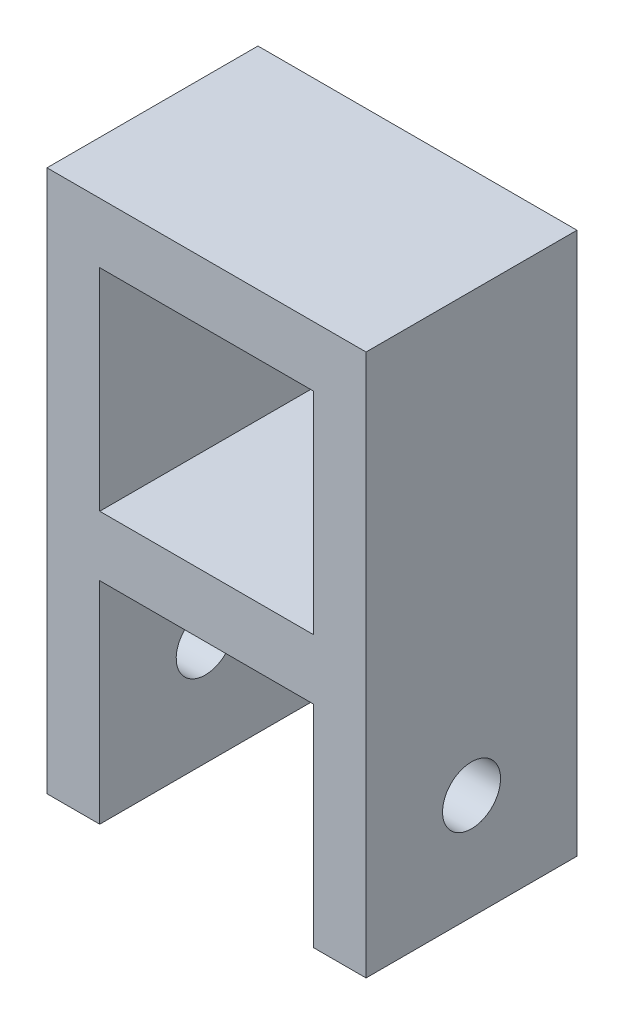
ISO-10303-21;
HEADER;
FILE_DESCRIPTION(('STEP AP214'),'2;1');
FILE_NAME('part.step','',(''),(''),'','','');
FILE_SCHEMA(('AUTOMOTIVE_DESIGN { 1 0 10303 214 1 1 1 1 }'));
ENDSEC;
DATA;
#1=APPLICATION_CONTEXT('core data for automotive mechanical design processes');
#2=APPLICATION_PROTOCOL_DEFINITION('international standard','automotive_design',2000,#1);
#3=PRODUCT_CONTEXT('',#1,'mechanical');
#4=PRODUCT('Part','Part','',(#3));
#5=PRODUCT_RELATED_PRODUCT_CATEGORY('part','',(#4));
#6=PRODUCT_DEFINITION_FORMATION('','',#4);
#7=PRODUCT_DEFINITION_CONTEXT('part definition',#1,'design');
#8=PRODUCT_DEFINITION('design','',#6,#7);
#9=PRODUCT_DEFINITION_SHAPE('','',#8);
#10=(LENGTH_UNIT() NAMED_UNIT(*) SI_UNIT(.MILLI.,.METRE.));
#11=(NAMED_UNIT(*) PLANE_ANGLE_UNIT() SI_UNIT($,.RADIAN.));
#12=(NAMED_UNIT(*) SI_UNIT($,.STERADIAN.) SOLID_ANGLE_UNIT());
#13=UNCERTAINTY_MEASURE_WITH_UNIT(LENGTH_MEASURE(1.E-05),#10,'distance_accuracy_value','');
#14=(GEOMETRIC_REPRESENTATION_CONTEXT(3) GLOBAL_UNCERTAINTY_ASSIGNED_CONTEXT((#13)) GLOBAL_UNIT_ASSIGNED_CONTEXT((#10,
#11,#12)) REPRESENTATION_CONTEXT('',''));
#15=CARTESIAN_POINT('',(0.,0.,0.));
#16=DIRECTION('',(0.,0.,1.));
#17=DIRECTION('',(1.,0.,0.));
#18=AXIS2_PLACEMENT_3D('',#15,#16,#17);
#19=CARTESIAN_POINT('',(0.,0.,20.));
#20=DIRECTION('',(0.,0.,-1.));
#21=DIRECTION('',(-1.,0.,0.));
#22=AXIS2_PLACEMENT_3D('',#19,#20,#21);
#23=PLANE('',#22);
#24=DIRECTION('',(1.,0.,0.));
#25=VECTOR('',#24,1.);
#26=CARTESIAN_POINT('',(-10.125,0.,20.));
#27=LINE('',#26,#25);
#28=CARTESIAN_POINT('',(-15.125,0.,20.));
#29=VERTEX_POINT('',#28);
#30=CARTESIAN_POINT('',(-10.125,0.,20.));
#31=VERTEX_POINT('',#30);
#32=EDGE_CURVE('E179',#29,#31,#27,.T.);
#33=ORIENTED_EDGE('',*,*,#32,.T.);
#34=DIRECTION('',(0.,1.,0.));
#35=VECTOR('',#34,1.);
#36=CARTESIAN_POINT('',(-10.125,0.,20.));
#37=LINE('',#36,#35);
#38=CARTESIAN_POINT('',(-10.125,20.,20.));
#39=VERTEX_POINT('',#38);
#40=EDGE_CURVE('E183',#31,#39,#37,.T.);
#41=ORIENTED_EDGE('',*,*,#40,.T.);
#42=DIRECTION('',(1.,0.,0.));
#43=VECTOR('',#42,1.);
#44=CARTESIAN_POINT('',(-10.125,20.,20.));
#45=LINE('',#44,#43);
#46=CARTESIAN_POINT('',(10.125,20.,20.));
#47=VERTEX_POINT('',#46);
#48=EDGE_CURVE('E187',#39,#47,#45,.T.);
#49=ORIENTED_EDGE('',*,*,#48,.T.);
#50=DIRECTION('',(0.,-1.,0.));
#51=VECTOR('',#50,1.);
#52=CARTESIAN_POINT('',(10.125,0.,20.));
#53=LINE('',#52,#51);
#54=CARTESIAN_POINT('',(10.125,0.,20.));
#55=VERTEX_POINT('',#54);
#56=EDGE_CURVE('E190',#47,#55,#53,.T.);
#57=ORIENTED_EDGE('',*,*,#56,.T.);
#58=DIRECTION('',(1.,0.,0.));
#59=VECTOR('',#58,1.);
#60=CARTESIAN_POINT('',(10.125,0.,20.));
#61=LINE('',#60,#59);
#62=CARTESIAN_POINT('',(15.125,0.,20.));
#63=VERTEX_POINT('',#62);
#64=EDGE_CURVE('E193',#55,#63,#61,.T.);
#65=ORIENTED_EDGE('',*,*,#64,.T.);
#66=DIRECTION('',(0.,1.,0.));
#67=VECTOR('',#66,1.);
#68=CARTESIAN_POINT('',(15.125,0.,20.));
#69=LINE('',#68,#67);
#70=CARTESIAN_POINT('',(15.125,51.4,20.));
#71=VERTEX_POINT('',#70);
#72=EDGE_CURVE('E196',#63,#71,#69,.T.);
#73=ORIENTED_EDGE('',*,*,#72,.T.);
#74=DIRECTION('',(-1.,0.,0.));
#75=VECTOR('',#74,1.);
#76=CARTESIAN_POINT('',(-15.125,51.4,20.));
#77=LINE('',#76,#75);
#78=CARTESIAN_POINT('',(-15.125,51.4,20.));
#79=VERTEX_POINT('',#78);
#80=EDGE_CURVE('E199',#71,#79,#77,.T.);
#81=ORIENTED_EDGE('',*,*,#80,.T.);
#82=DIRECTION('',(0.,-1.,0.));
#83=VECTOR('',#82,1.);
#84=CARTESIAN_POINT('',(-15.125,0.,20.));
#85=LINE('',#84,#83);
#86=EDGE_CURVE('E202',#79,#29,#85,.T.);
#87=ORIENTED_EDGE('',*,*,#86,.T.);
#88=EDGE_LOOP('',(#33,#41,#49,#57,#65,#73,#81,#87));
#89=FACE_BOUND('',#88,.T.);
#90=DIRECTION('',(0.,-1.,0.));
#91=VECTOR('',#90,1.);
#92=CARTESIAN_POINT('',(-10.125,45.7,20.));
#93=LINE('',#92,#91);
#94=CARTESIAN_POINT('',(-10.125,45.7,20.));
#95=VERTEX_POINT('',#94);
#96=CARTESIAN_POINT('',(-10.125,25.7,20.));
#97=VERTEX_POINT('',#96);
#98=EDGE_CURVE('E129',#95,#97,#93,.T.);
#99=ORIENTED_EDGE('',*,*,#98,.F.);
#100=DIRECTION('',(-1.,0.,0.));
#101=VECTOR('',#100,1.);
#102=CARTESIAN_POINT('',(-10.125,45.7,20.));
#103=LINE('',#102,#101);
#104=CARTESIAN_POINT('',(10.125,45.7,20.));
#105=VERTEX_POINT('',#104);
#106=EDGE_CURVE('E155',#105,#95,#103,.T.);
#107=ORIENTED_EDGE('',*,*,#106,.F.);
#108=DIRECTION('',(0.,1.,0.));
#109=VECTOR('',#108,1.);
#110=CARTESIAN_POINT('',(10.125,45.7,20.));
#111=LINE('',#110,#109);
#112=CARTESIAN_POINT('',(10.125,25.7,20.));
#113=VERTEX_POINT('',#112);
#114=EDGE_CURVE('E151',#113,#105,#111,.T.);
#115=ORIENTED_EDGE('',*,*,#114,.F.);
#116=DIRECTION('',(1.,0.,0.));
#117=VECTOR('',#116,1.);
#118=CARTESIAN_POINT('',(-10.125,25.7,20.));
#119=LINE('',#118,#117);
#120=EDGE_CURVE('E138',#97,#113,#119,.T.);
#121=ORIENTED_EDGE('',*,*,#120,.F.);
#122=EDGE_LOOP('',(#99,#107,#115,#121));
#123=FACE_BOUND('',#122,.T.);
#124=ADVANCED_FACE('F39',(#89,#123),#23,.F.);
#125=CARTESIAN_POINT('',(0.,0.,0.));
#126=DIRECTION('',(0.,0.,-1.));
#127=DIRECTION('',(-1.,0.,0.));
#128=AXIS2_PLACEMENT_3D('',#125,#126,#127);
#129=PLANE('',#128);
#130=DIRECTION('',(1.,0.,0.));
#131=VECTOR('',#130,1.);
#132=CARTESIAN_POINT('',(-10.125,0.,0.));
#133=LINE('',#132,#131);
#134=CARTESIAN_POINT('',(-15.125,0.,0.));
#135=VERTEX_POINT('',#134);
#136=CARTESIAN_POINT('',(-10.125,0.,0.));
#137=VERTEX_POINT('',#136);
#138=EDGE_CURVE('E147',#135,#137,#133,.T.);
#139=ORIENTED_EDGE('',*,*,#138,.F.);
#140=DIRECTION('',(0.,-1.,0.));
#141=VECTOR('',#140,1.);
#142=CARTESIAN_POINT('',(-15.125,0.,0.));
#143=LINE('',#142,#141);
#144=CARTESIAN_POINT('',(-15.125,51.4,0.));
#145=VERTEX_POINT('',#144);
#146=EDGE_CURVE('E184',#145,#135,#143,.T.);
#147=ORIENTED_EDGE('',*,*,#146,.F.);
#148=DIRECTION('',(-1.,0.,0.));
#149=VECTOR('',#148,1.);
#150=CARTESIAN_POINT('',(-15.125,51.4,0.));
#151=LINE('',#150,#149);
#152=CARTESIAN_POINT('',(15.125,51.4,0.));
#153=VERTEX_POINT('',#152);
#154=EDGE_CURVE('E224',#153,#145,#151,.T.);
#155=ORIENTED_EDGE('',*,*,#154,.F.);
#156=DIRECTION('',(0.,1.,0.));
#157=VECTOR('',#156,1.);
#158=CARTESIAN_POINT('',(15.125,0.,0.));
#159=LINE('',#158,#157);
#160=CARTESIAN_POINT('',(15.125,0.,0.));
#161=VERTEX_POINT('',#160);
#162=EDGE_CURVE('E221',#161,#153,#159,.T.);
#163=ORIENTED_EDGE('',*,*,#162,.F.);
#164=DIRECTION('',(1.,0.,0.));
#165=VECTOR('',#164,1.);
#166=CARTESIAN_POINT('',(10.125,0.,0.));
#167=LINE('',#166,#165);
#168=CARTESIAN_POINT('',(10.125,0.,0.));
#169=VERTEX_POINT('',#168);
#170=EDGE_CURVE('E218',#169,#161,#167,.T.);
#171=ORIENTED_EDGE('',*,*,#170,.F.);
#172=DIRECTION('',(0.,-1.,0.));
#173=VECTOR('',#172,1.);
#174=CARTESIAN_POINT('',(10.125,0.,0.));
#175=LINE('',#174,#173);
#176=CARTESIAN_POINT('',(10.125,20.,0.));
#177=VERTEX_POINT('',#176);
#178=EDGE_CURVE('E215',#177,#169,#175,.T.);
#179=ORIENTED_EDGE('',*,*,#178,.F.);
#180=DIRECTION('',(1.,0.,0.));
#181=VECTOR('',#180,1.);
#182=CARTESIAN_POINT('',(-10.125,20.,0.));
#183=LINE('',#182,#181);
#184=CARTESIAN_POINT('',(-10.125,20.,0.));
#185=VERTEX_POINT('',#184);
#186=EDGE_CURVE('E212',#185,#177,#183,.T.);
#187=ORIENTED_EDGE('',*,*,#186,.F.);
#188=DIRECTION('',(0.,1.,0.));
#189=VECTOR('',#188,1.);
#190=CARTESIAN_POINT('',(-10.125,0.,0.));
#191=LINE('',#190,#189);
#192=EDGE_CURVE('E209',#137,#185,#191,.T.);
#193=ORIENTED_EDGE('',*,*,#192,.F.);
#194=EDGE_LOOP('',(#139,#147,#155,#163,#171,#179,#187,#193));
#195=FACE_BOUND('',#194,.T.);
#196=DIRECTION('',(-1.,0.,0.));
#197=VECTOR('',#196,1.);
#198=CARTESIAN_POINT('',(-10.125,45.7,0.));
#199=LINE('',#198,#197);
#200=CARTESIAN_POINT('',(10.125,45.7,0.));
#201=VERTEX_POINT('',#200);
#202=CARTESIAN_POINT('',(-10.125,45.7,0.));
#203=VERTEX_POINT('',#202);
#204=EDGE_CURVE('E139',#201,#203,#199,.T.);
#205=ORIENTED_EDGE('',*,*,#204,.T.);
#206=DIRECTION('',(0.,-1.,0.));
#207=VECTOR('',#206,1.);
#208=CARTESIAN_POINT('',(-10.125,45.7,0.));
#209=LINE('',#208,#207);
#210=CARTESIAN_POINT('',(-10.125,25.7,0.));
#211=VERTEX_POINT('',#210);
#212=EDGE_CURVE('E63',#203,#211,#209,.T.);
#213=ORIENTED_EDGE('',*,*,#212,.T.);
#214=DIRECTION('',(1.,0.,0.));
#215=VECTOR('',#214,1.);
#216=CARTESIAN_POINT('',(-10.125,25.7,0.));
#217=LINE('',#216,#215);
#218=CARTESIAN_POINT('',(10.125,25.7,0.));
#219=VERTEX_POINT('',#218);
#220=EDGE_CURVE('E145',#211,#219,#217,.T.);
#221=ORIENTED_EDGE('',*,*,#220,.T.);
#222=DIRECTION('',(0.,1.,0.));
#223=VECTOR('',#222,1.);
#224=CARTESIAN_POINT('',(10.125,45.7,0.));
#225=LINE('',#224,#223);
#226=EDGE_CURVE('E166',#219,#201,#225,.T.);
#227=ORIENTED_EDGE('',*,*,#226,.T.);
#228=EDGE_LOOP('',(#205,#213,#221,#227));
#229=FACE_BOUND('',#228,.T.);
#230=ADVANCED_FACE('F263',(#195,#229),#129,.T.);
#231=CARTESIAN_POINT('',(-10.125,0.,20.));
#232=DIRECTION('',(0.,1.,0.));
#233=DIRECTION('',(-1.,0.,0.));
#234=AXIS2_PLACEMENT_3D('',#231,#232,#233);
#235=PLANE('',#234);
#236=ORIENTED_EDGE('',*,*,#138,.T.);
#237=DIRECTION('',(0.,0.,-1.));
#238=VECTOR('',#237,1.);
#239=CARTESIAN_POINT('',(-10.125,0.,20.));
#240=LINE('',#239,#238);
#241=EDGE_CURVE('E11',#31,#137,#240,.T.);
#242=ORIENTED_EDGE('',*,*,#241,.F.);
#243=ORIENTED_EDGE('',*,*,#32,.F.);
#244=DIRECTION('',(0.,0.,-1.));
#245=VECTOR('',#244,1.);
#246=CARTESIAN_POINT('',(-15.125,0.,20.));
#247=LINE('',#246,#245);
#248=EDGE_CURVE('E205',#29,#135,#247,.T.);
#249=ORIENTED_EDGE('',*,*,#248,.T.);
#250=EDGE_LOOP('',(#236,#242,#243,#249));
#251=FACE_BOUND('',#250,.T.);
#252=ADVANCED_FACE('F41',(#251),#235,.F.);
#253=CARTESIAN_POINT('',(-10.125,0.,20.));
#254=DIRECTION('',(-1.,0.,0.));
#255=DIRECTION('',(0.,-1.,0.));
#256=AXIS2_PLACEMENT_3D('',#253,#254,#255);
#257=PLANE('',#256);
#258=CARTESIAN_POINT('',(-10.125,10.,10.));
#259=DIRECTION('',(-1.,0.,0.));
#260=DIRECTION('',(0.,-1.,0.));
#261=AXIS2_PLACEMENT_3D('',#258,#259,#260);
#262=CIRCLE('',#261,2.75);
#263=CARTESIAN_POINT('',(-10.125,7.25,10.));
#264=VERTEX_POINT('',#263);
#265=EDGE_CURVE('E163',#264,#264,#262,.T.);
#266=ORIENTED_EDGE('',*,*,#265,.T.);
#267=EDGE_LOOP('',(#266));
#268=FACE_BOUND('',#267,.T.);
#269=ORIENTED_EDGE('',*,*,#192,.T.);
#270=DIRECTION('',(0.,0.,-1.));
#271=VECTOR('',#270,1.);
#272=CARTESIAN_POINT('',(-10.125,20.,20.));
#273=LINE('',#272,#271);
#274=EDGE_CURVE('E48',#39,#185,#273,.T.);
#275=ORIENTED_EDGE('',*,*,#274,.F.);
#276=ORIENTED_EDGE('',*,*,#40,.F.);
#277=ORIENTED_EDGE('',*,*,#241,.T.);
#278=EDGE_LOOP('',(#269,#275,#276,#277));
#279=FACE_BOUND('',#278,.T.);
#280=ADVANCED_FACE('F280',(#268,#279),#257,.F.);
#281=CARTESIAN_POINT('',(-10.125,20.,20.));
#282=DIRECTION('',(0.,1.,0.));
#283=DIRECTION('',(0.,0.,1.));
#284=AXIS2_PLACEMENT_3D('',#281,#282,#283);
#285=PLANE('',#284);
#286=ORIENTED_EDGE('',*,*,#186,.T.);
#287=DIRECTION('',(0.,0.,-1.));
#288=VECTOR('',#287,1.);
#289=CARTESIAN_POINT('',(10.125,20.,20.));
#290=LINE('',#289,#288);
#291=EDGE_CURVE('E248',#47,#177,#290,.T.);
#292=ORIENTED_EDGE('',*,*,#291,.F.);
#293=ORIENTED_EDGE('',*,*,#48,.F.);
#294=ORIENTED_EDGE('',*,*,#274,.T.);
#295=EDGE_LOOP('',(#286,#292,#293,#294));
#296=FACE_BOUND('',#295,.T.);
#297=ADVANCED_FACE('F257',(#296),#285,.F.);
#298=CARTESIAN_POINT('',(10.125,0.,20.));
#299=DIRECTION('',(1.,0.,0.));
#300=DIRECTION('',(0.,1.,0.));
#301=AXIS2_PLACEMENT_3D('',#298,#299,#300);
#302=PLANE('',#301);
#303=CARTESIAN_POINT('',(10.125,10.,10.));
#304=DIRECTION('',(1.,0.,0.));
#305=DIRECTION('',(0.,1.,0.));
#306=AXIS2_PLACEMENT_3D('',#303,#304,#305);
#307=CIRCLE('',#306,2.75);
#308=CARTESIAN_POINT('',(10.125,12.75,10.));
#309=VERTEX_POINT('',#308);
#310=EDGE_CURVE('E323',#309,#309,#307,.T.);
#311=ORIENTED_EDGE('',*,*,#310,.T.);
#312=EDGE_LOOP('',(#311));
#313=FACE_BOUND('',#312,.T.);
#314=ORIENTED_EDGE('',*,*,#178,.T.);
#315=DIRECTION('',(0.,0.,-1.));
#316=VECTOR('',#315,1.);
#317=CARTESIAN_POINT('',(10.125,0.,20.));
#318=LINE('',#317,#316);
#319=EDGE_CURVE('E244',#55,#169,#318,.T.);
#320=ORIENTED_EDGE('',*,*,#319,.F.);
#321=ORIENTED_EDGE('',*,*,#56,.F.);
#322=ORIENTED_EDGE('',*,*,#291,.T.);
#323=EDGE_LOOP('',(#314,#320,#321,#322));
#324=FACE_BOUND('',#323,.T.);
#325=ADVANCED_FACE('F269',(#313,#324),#302,.F.);
#326=CARTESIAN_POINT('',(10.125,0.,20.));
#327=DIRECTION('',(0.,1.,0.));
#328=DIRECTION('',(-1.,0.,0.));
#329=AXIS2_PLACEMENT_3D('',#326,#327,#328);
#330=PLANE('',#329);
#331=ORIENTED_EDGE('',*,*,#170,.T.);
#332=DIRECTION('',(0.,0.,-1.));
#333=VECTOR('',#332,1.);
#334=CARTESIAN_POINT('',(15.125,0.,20.));
#335=LINE('',#334,#333);
#336=EDGE_CURVE('E240',#63,#161,#335,.T.);
#337=ORIENTED_EDGE('',*,*,#336,.F.);
#338=ORIENTED_EDGE('',*,*,#64,.F.);
#339=ORIENTED_EDGE('',*,*,#319,.T.);
#340=EDGE_LOOP('',(#331,#337,#338,#339));
#341=FACE_BOUND('',#340,.T.);
#342=ADVANCED_FACE('F273',(#341),#330,.F.);
#343=CARTESIAN_POINT('',(15.125,0.,20.));
#344=DIRECTION('',(-1.,0.,0.));
#345=DIRECTION('',(0.,0.,1.));
#346=AXIS2_PLACEMENT_3D('',#343,#344,#345);
#347=PLANE('',#346);
#348=CARTESIAN_POINT('',(15.125,10.,10.));
#349=DIRECTION('',(1.,0.,0.));
#350=DIRECTION('',(0.,0.,-1.));
#351=AXIS2_PLACEMENT_3D('',#348,#349,#350);
#352=CIRCLE('',#351,2.75);
#353=CARTESIAN_POINT('',(15.125,10.,7.25));
#354=VERTEX_POINT('',#353);
#355=EDGE_CURVE('E324',#354,#354,#352,.T.);
#356=ORIENTED_EDGE('',*,*,#355,.F.);
#357=EDGE_LOOP('',(#356));
#358=FACE_BOUND('',#357,.T.);
#359=ORIENTED_EDGE('',*,*,#162,.T.);
#360=DIRECTION('',(0.,0.,-1.));
#361=VECTOR('',#360,1.);
#362=CARTESIAN_POINT('',(15.125,51.4,20.));
#363=LINE('',#362,#361);
#364=EDGE_CURVE('E236',#71,#153,#363,.T.);
#365=ORIENTED_EDGE('',*,*,#364,.F.);
#366=ORIENTED_EDGE('',*,*,#72,.F.);
#367=ORIENTED_EDGE('',*,*,#336,.T.);
#368=EDGE_LOOP('',(#359,#365,#366,#367));
#369=FACE_BOUND('',#368,.T.);
#370=ADVANCED_FACE('F293',(#358,#369),#347,.F.);
#371=CARTESIAN_POINT('',(-15.125,51.4,20.));
#372=DIRECTION('',(0.,-1.,0.));
#373=DIRECTION('',(0.,0.,-1.));
#374=AXIS2_PLACEMENT_3D('',#371,#372,#373);
#375=PLANE('',#374);
#376=ORIENTED_EDGE('',*,*,#154,.T.);
#377=DIRECTION('',(0.,0.,-1.));
#378=VECTOR('',#377,1.);
#379=CARTESIAN_POINT('',(-15.125,51.4,20.));
#380=LINE('',#379,#378);
#381=EDGE_CURVE('E232',#79,#145,#380,.T.);
#382=ORIENTED_EDGE('',*,*,#381,.F.);
#383=ORIENTED_EDGE('',*,*,#80,.F.);
#384=ORIENTED_EDGE('',*,*,#364,.T.);
#385=EDGE_LOOP('',(#376,#382,#383,#384));
#386=FACE_BOUND('',#385,.T.);
#387=ADVANCED_FACE('F291',(#386),#375,.F.);
#388=CARTESIAN_POINT('',(-15.125,0.,20.));
#389=DIRECTION('',(1.,0.,0.));
#390=DIRECTION('',(0.,0.,-1.));
#391=AXIS2_PLACEMENT_3D('',#388,#389,#390);
#392=PLANE('',#391);
#393=CARTESIAN_POINT('',(-15.125,10.,10.));
#394=DIRECTION('',(1.,0.,0.));
#395=DIRECTION('',(0.,0.,-1.));
#396=AXIS2_PLACEMENT_3D('',#393,#394,#395);
#397=CIRCLE('',#396,2.75);
#398=CARTESIAN_POINT('',(-15.125,10.,7.25));
#399=VERTEX_POINT('',#398);
#400=EDGE_CURVE('E320',#399,#399,#397,.T.);
#401=ORIENTED_EDGE('',*,*,#400,.T.);
#402=EDGE_LOOP('',(#401));
#403=FACE_BOUND('',#402,.T.);
#404=ORIENTED_EDGE('',*,*,#146,.T.);
#405=ORIENTED_EDGE('',*,*,#248,.F.);
#406=ORIENTED_EDGE('',*,*,#86,.F.);
#407=ORIENTED_EDGE('',*,*,#381,.T.);
#408=EDGE_LOOP('',(#404,#405,#406,#407));
#409=FACE_BOUND('',#408,.T.);
#410=ADVANCED_FACE('F286',(#403,#409),#392,.F.);
#411=CARTESIAN_POINT('',(-10.125,45.7,20.));
#412=DIRECTION('',(1.,0.,0.));
#413=DIRECTION('',(0.,1.,0.));
#414=AXIS2_PLACEMENT_3D('',#411,#412,#413);
#415=PLANE('',#414);
#416=ORIENTED_EDGE('',*,*,#212,.F.);
#417=DIRECTION('',(0.,0.,-1.));
#418=VECTOR('',#417,1.);
#419=CARTESIAN_POINT('',(-10.125,45.7,20.));
#420=LINE('',#419,#418);
#421=EDGE_CURVE('E133',#95,#203,#420,.T.);
#422=ORIENTED_EDGE('',*,*,#421,.F.);
#423=ORIENTED_EDGE('',*,*,#98,.T.);
#424=DIRECTION('',(0.,0.,-1.));
#425=VECTOR('',#424,1.);
#426=CARTESIAN_POINT('',(-10.125,25.7,20.));
#427=LINE('',#426,#425);
#428=EDGE_CURVE('E132',#97,#211,#427,.T.);
#429=ORIENTED_EDGE('',*,*,#428,.T.);
#430=EDGE_LOOP('',(#416,#422,#423,#429));
#431=FACE_BOUND('',#430,.T.);
#432=ADVANCED_FACE('F131',(#431),#415,.T.);
#433=CARTESIAN_POINT('',(-10.125,25.7,20.));
#434=DIRECTION('',(0.,1.,0.));
#435=DIRECTION('',(0.,0.,1.));
#436=AXIS2_PLACEMENT_3D('',#433,#434,#435);
#437=PLANE('',#436);
#438=ORIENTED_EDGE('',*,*,#220,.F.);
#439=ORIENTED_EDGE('',*,*,#428,.F.);
#440=ORIENTED_EDGE('',*,*,#120,.T.);
#441=DIRECTION('',(0.,0.,-1.));
#442=VECTOR('',#441,1.);
#443=CARTESIAN_POINT('',(10.125,25.7,20.));
#444=LINE('',#443,#442);
#445=EDGE_CURVE('E148',#113,#219,#444,.T.);
#446=ORIENTED_EDGE('',*,*,#445,.T.);
#447=EDGE_LOOP('',(#438,#439,#440,#446));
#448=FACE_BOUND('',#447,.T.);
#449=ADVANCED_FACE('F142',(#448),#437,.T.);
#450=CARTESIAN_POINT('',(10.125,45.7,20.));
#451=DIRECTION('',(-1.,0.,0.));
#452=DIRECTION('',(0.,-1.,0.));
#453=AXIS2_PLACEMENT_3D('',#450,#451,#452);
#454=PLANE('',#453);
#455=ORIENTED_EDGE('',*,*,#226,.F.);
#456=ORIENTED_EDGE('',*,*,#445,.F.);
#457=ORIENTED_EDGE('',*,*,#114,.T.);
#458=DIRECTION('',(0.,0.,-1.));
#459=VECTOR('',#458,1.);
#460=CARTESIAN_POINT('',(10.125,45.7,20.));
#461=LINE('',#460,#459);
#462=EDGE_CURVE('E55',#105,#201,#461,.T.);
#463=ORIENTED_EDGE('',*,*,#462,.T.);
#464=EDGE_LOOP('',(#455,#456,#457,#463));
#465=FACE_BOUND('',#464,.T.);
#466=ADVANCED_FACE('F347',(#465),#454,.T.);
#467=CARTESIAN_POINT('',(-10.125,45.7,20.));
#468=DIRECTION('',(0.,-1.,0.));
#469=DIRECTION('',(0.,0.,-1.));
#470=AXIS2_PLACEMENT_3D('',#467,#468,#469);
#471=PLANE('',#470);
#472=ORIENTED_EDGE('',*,*,#204,.F.);
#473=ORIENTED_EDGE('',*,*,#462,.F.);
#474=ORIENTED_EDGE('',*,*,#106,.T.);
#475=ORIENTED_EDGE('',*,*,#421,.T.);
#476=EDGE_LOOP('',(#472,#473,#474,#475));
#477=FACE_BOUND('',#476,.T.);
#478=ADVANCED_FACE('F340',(#477),#471,.T.);
#479=CARTESIAN_POINT('',(-15.125,10.,10.));
#480=DIRECTION('',(1.,0.,0.));
#481=DIRECTION('',(0.,0.,-1.));
#482=AXIS2_PLACEMENT_3D('',#479,#480,#481);
#483=CYLINDRICAL_SURFACE('',#482,2.75);
#484=ORIENTED_EDGE('',*,*,#400,.F.);
#485=EDGE_LOOP('',(#484));
#486=FACE_BOUND('',#485,.T.);
#487=ORIENTED_EDGE('',*,*,#265,.F.);
#488=EDGE_LOOP('',(#487));
#489=FACE_BOUND('',#488,.T.);
#490=ADVANCED_FACE('F337',(#486,#489),#483,.F.);
#491=ORIENTED_EDGE('',*,*,#355,.T.);
#492=EDGE_LOOP('',(#491));
#493=FACE_BOUND('',#492,.T.);
#494=ORIENTED_EDGE('',*,*,#310,.F.);
#495=EDGE_LOOP('',(#494));
#496=FACE_BOUND('',#495,.T.);
#497=ADVANCED_FACE('F339',(#493,#496),#483,.F.);
#498=CLOSED_SHELL('',(#124,#230,#252,#280,#297,#325,#342,#370,#387,#410,#432,#449,#466,#478,
#490,#497));
#499=MANIFOLD_SOLID_BREP('B2',#498);
#500=ADVANCED_BREP_SHAPE_REPRESENTATION('',(#18,#499),#14);
#501=SHAPE_DEFINITION_REPRESENTATION(#9,#500);
ENDSEC;
END-ISO-10303-21;
